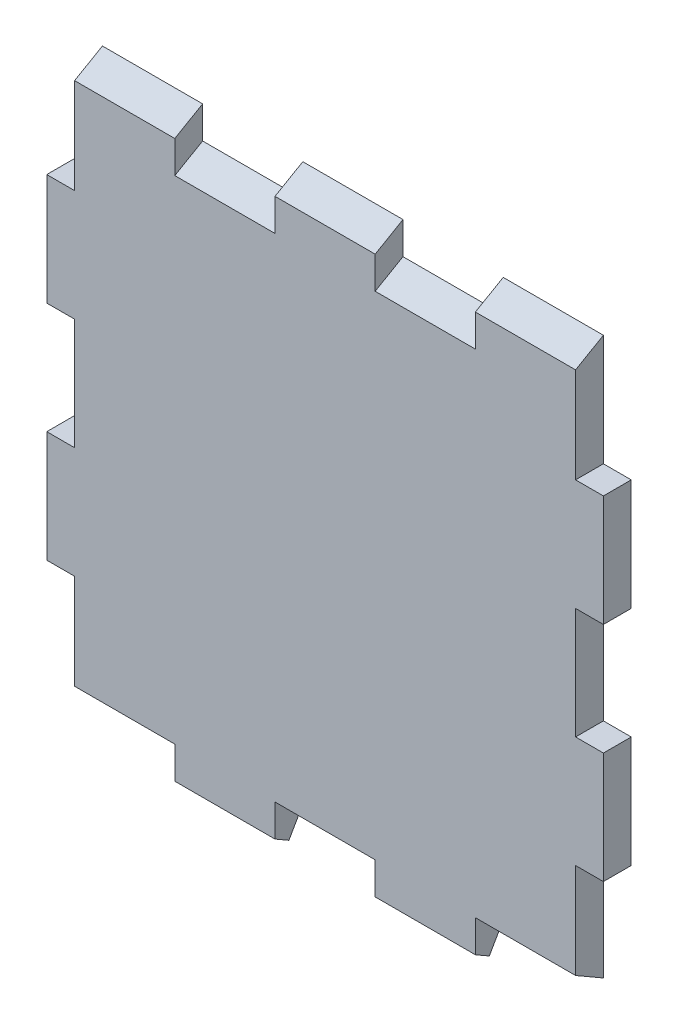
ISO-10303-21;
HEADER;
FILE_DESCRIPTION(('STEP AP214'),'2;1');
FILE_NAME('part.step','',(''),(''),'','','');
FILE_SCHEMA(('AUTOMOTIVE_DESIGN { 1 0 10303 214 1 1 1 1 }'));
ENDSEC;
DATA;
#1=APPLICATION_CONTEXT('core data for automotive mechanical design processes');
#2=APPLICATION_PROTOCOL_DEFINITION('international standard','automotive_design',2000,#1);
#3=PRODUCT_CONTEXT('',#1,'mechanical');
#4=PRODUCT('Part','Part','',(#3));
#5=PRODUCT_RELATED_PRODUCT_CATEGORY('part','',(#4));
#6=PRODUCT_DEFINITION_FORMATION('','',#4);
#7=PRODUCT_DEFINITION_CONTEXT('part definition',#1,'design');
#8=PRODUCT_DEFINITION('design','',#6,#7);
#9=PRODUCT_DEFINITION_SHAPE('','',#8);
#10=(LENGTH_UNIT() NAMED_UNIT(*) SI_UNIT(.MILLI.,.METRE.));
#11=(NAMED_UNIT(*) PLANE_ANGLE_UNIT() SI_UNIT($,.RADIAN.));
#12=(NAMED_UNIT(*) SI_UNIT($,.STERADIAN.) SOLID_ANGLE_UNIT());
#13=UNCERTAINTY_MEASURE_WITH_UNIT(LENGTH_MEASURE(1.E-05),#10,'distance_accuracy_value','');
#14=(GEOMETRIC_REPRESENTATION_CONTEXT(3) GLOBAL_UNCERTAINTY_ASSIGNED_CONTEXT((#13)) GLOBAL_UNIT_ASSIGNED_CONTEXT((#10,
#11,#12)) REPRESENTATION_CONTEXT('',''));
#15=CARTESIAN_POINT('',(0.,0.,0.));
#16=DIRECTION('',(0.,0.,1.));
#17=DIRECTION('',(1.,0.,0.));
#18=AXIS2_PLACEMENT_3D('',#15,#16,#17);
#19=CARTESIAN_POINT('',(0.,0.,5.));
#20=DIRECTION('',(-1.,0.,0.));
#21=DIRECTION('',(0.,0.,1.));
#22=AXIS2_PLACEMENT_3D('',#19,#20,#21);
#23=PLANE('',#22);
#24=DIRECTION('',(0.,1.,0.));
#25=VECTOR('',#24,1.);
#26=CARTESIAN_POINT('',(0.,0.,5.));
#27=LINE('',#26,#25);
#28=CARTESIAN_POINT('',(0.,-22.8867513459641,5.));
#29=VERTEX_POINT('',#28);
#30=CARTESIAN_POINT('',(0.,-5.77350269191229,5.));
#31=VERTEX_POINT('',#30);
#32=EDGE_CURVE('E48',#29,#31,#27,.T.);
#33=ORIENTED_EDGE('',*,*,#32,.F.);
#34=DIRECTION('',(0.,0.,-1.));
#35=VECTOR('',#34,1.);
#36=CARTESIAN_POINT('',(0.,-22.8867513459642,5.));
#37=LINE('',#36,#35);
#38=CARTESIAN_POINT('',(0.,-22.8867513459642,0.));
#39=VERTEX_POINT('',#38);
#40=EDGE_CURVE('E290',#29,#39,#37,.T.);
#41=ORIENTED_EDGE('',*,*,#40,.T.);
#42=DIRECTION('',(0.,1.,0.));
#43=VECTOR('',#42,1.);
#44=CARTESIAN_POINT('',(0.,0.,0.));
#45=LINE('',#44,#43);
#46=CARTESIAN_POINT('',(0.,-2.88675134596416,0.));
#47=VERTEX_POINT('',#46);
#48=EDGE_CURVE('E487',#39,#47,#45,.T.);
#49=ORIENTED_EDGE('',*,*,#48,.T.);
#50=DIRECTION('',(0.,0.5,-0.866025403784439));
#51=VECTOR('',#50,1.);
#52=CARTESIAN_POINT('',(0.,-5.77350269191229,5.));
#53=LINE('',#52,#51);
#54=EDGE_CURVE('E476',#31,#47,#53,.T.);
#55=ORIENTED_EDGE('',*,*,#54,.F.);
#56=EDGE_LOOP('',(#33,#41,#49,#55));
#57=FACE_BOUND('',#56,.T.);
#58=ADVANCED_FACE('F33',(#57),#23,.F.);
#59=DIRECTION('',(0.,0.,-1.));
#60=VECTOR('',#59,1.);
#61=CARTESIAN_POINT('',(0.,-82.8867513459642,5.));
#62=LINE('',#61,#60);
#63=CARTESIAN_POINT('',(0.,-82.8867513459642,5.));
#64=VERTEX_POINT('',#63);
#65=CARTESIAN_POINT('',(0.,-82.8867513459642,0.));
#66=VERTEX_POINT('',#65);
#67=EDGE_CURVE('E325',#64,#66,#62,.T.);
#68=ORIENTED_EDGE('',*,*,#67,.F.);
#69=CARTESIAN_POINT('',(0.,-100.,5.));
#70=VERTEX_POINT('',#69);
#71=EDGE_CURVE('E494',#70,#64,#27,.T.);
#72=ORIENTED_EDGE('',*,*,#71,.F.);
#73=DIRECTION('',(0.,-0.500000000002089,-0.866025403783233));
#74=VECTOR('',#73,1.);
#75=CARTESIAN_POINT('',(0.,-100.,5.));
#76=LINE('',#75,#74);
#77=CARTESIAN_POINT('',(0.,-102.886751345964,0.));
#78=VERTEX_POINT('',#77);
#79=EDGE_CURVE('E447',#70,#78,#76,.T.);
#80=ORIENTED_EDGE('',*,*,#79,.T.);
#81=EDGE_CURVE('E509',#78,#66,#45,.T.);
#82=ORIENTED_EDGE('',*,*,#81,.T.);
#83=EDGE_LOOP('',(#68,#72,#80,#82));
#84=FACE_BOUND('',#83,.T.);
#85=ADVANCED_FACE('F567',(#84),#23,.F.);
#86=CARTESIAN_POINT('',(-90.,0.,5.));
#87=DIRECTION('',(1.,0.,0.));
#88=DIRECTION('',(0.,0.,-1.));
#89=AXIS2_PLACEMENT_3D('',#86,#87,#88);
#90=PLANE('',#89);
#91=DIRECTION('',(0.,-1.,0.));
#92=VECTOR('',#91,1.);
#93=CARTESIAN_POINT('',(-90.,0.,0.));
#94=LINE('',#93,#92);
#95=CARTESIAN_POINT('',(-90.,-42.8867513459642,0.));
#96=VERTEX_POINT('',#95);
#97=CARTESIAN_POINT('',(-90.,-62.8867513459642,0.));
#98=VERTEX_POINT('',#97);
#99=EDGE_CURVE('E517',#96,#98,#94,.T.);
#100=ORIENTED_EDGE('',*,*,#99,.T.);
#101=DIRECTION('',(0.,0.,-1.));
#102=VECTOR('',#101,1.);
#103=CARTESIAN_POINT('',(-90.,-62.8867513459642,5.));
#104=LINE('',#103,#102);
#105=CARTESIAN_POINT('',(-90.,-62.8867513459642,5.));
#106=VERTEX_POINT('',#105);
#107=EDGE_CURVE('E348',#106,#98,#104,.T.);
#108=ORIENTED_EDGE('',*,*,#107,.F.);
#109=DIRECTION('',(0.,-1.,0.));
#110=VECTOR('',#109,1.);
#111=CARTESIAN_POINT('',(-90.,0.,5.));
#112=LINE('',#111,#110);
#113=CARTESIAN_POINT('',(-90.,-42.8867513459642,5.));
#114=VERTEX_POINT('',#113);
#115=EDGE_CURVE('E503',#114,#106,#112,.T.);
#116=ORIENTED_EDGE('',*,*,#115,.F.);
#117=DIRECTION('',(0.,0.,-1.));
#118=VECTOR('',#117,1.);
#119=CARTESIAN_POINT('',(-90.,-42.8867513459642,5.));
#120=LINE('',#119,#118);
#121=EDGE_CURVE('E367',#114,#96,#120,.T.);
#122=ORIENTED_EDGE('',*,*,#121,.T.);
#123=EDGE_LOOP('',(#100,#108,#116,#122));
#124=FACE_BOUND('',#123,.T.);
#125=ADVANCED_FACE('F619',(#124),#90,.F.);
#126=DIRECTION('',(0.,0.,-1.));
#127=VECTOR('',#126,1.);
#128=CARTESIAN_POINT('',(-90.,-22.8867513459642,5.));
#129=LINE('',#128,#127);
#130=CARTESIAN_POINT('',(-90.,-22.8867513459642,5.));
#131=VERTEX_POINT('',#130);
#132=CARTESIAN_POINT('',(-90.,-22.8867513459642,0.));
#133=VERTEX_POINT('',#132);
#134=EDGE_CURVE('E375',#131,#133,#129,.T.);
#135=ORIENTED_EDGE('',*,*,#134,.F.);
#136=CARTESIAN_POINT('',(-90.,-5.77350269191229,5.));
#137=VERTEX_POINT('',#136);
#138=EDGE_CURVE('E499',#137,#131,#112,.T.);
#139=ORIENTED_EDGE('',*,*,#138,.F.);
#140=DIRECTION('',(0.,0.5,-0.866025403784439));
#141=VECTOR('',#140,1.);
#142=CARTESIAN_POINT('',(-90.,-5.77350269191229,5.));
#143=LINE('',#142,#141);
#144=CARTESIAN_POINT('',(-90.,-2.88675134596416,0.));
#145=VERTEX_POINT('',#144);
#146=EDGE_CURVE('E478',#137,#145,#143,.T.);
#147=ORIENTED_EDGE('',*,*,#146,.T.);
#148=EDGE_CURVE('E514',#145,#133,#94,.T.);
#149=ORIENTED_EDGE('',*,*,#148,.T.);
#150=EDGE_LOOP('',(#135,#139,#147,#149));
#151=FACE_BOUND('',#150,.T.);
#152=ADVANCED_FACE('F627',(#151),#90,.F.);
#153=CARTESIAN_POINT('',(-90.,-100.,5.));
#154=DIRECTION('',(0.,-0.866025403783232,0.500000000002089));
#155=DIRECTION('',(0.,-0.500000000002089,-0.866025403783233));
#156=AXIS2_PLACEMENT_3D('',#153,#154,#155);
#157=PLANE('',#156);
#158=DIRECTION('',(0.,-0.500000000002089,-0.866025403783233));
#159=VECTOR('',#158,1.);
#160=CARTESIAN_POINT('',(-36.,-100.,5.));
#161=LINE('',#160,#159);
#162=CARTESIAN_POINT('',(-36.,-100.,5.));
#163=VERTEX_POINT('',#162);
#164=CARTESIAN_POINT('',(-36.,-102.886751345964,0.));
#165=VERTEX_POINT('',#164);
#166=EDGE_CURVE('E526',#163,#165,#161,.T.);
#167=ORIENTED_EDGE('',*,*,#166,.F.);
#168=DIRECTION('',(1.,0.,0.));
#169=VECTOR('',#168,1.);
#170=CARTESIAN_POINT('',(0.,-100.,5.));
#171=LINE('',#170,#169);
#172=CARTESIAN_POINT('',(-54.,-100.,5.));
#173=VERTEX_POINT('',#172);
#174=EDGE_CURVE('E508',#173,#163,#171,.T.);
#175=ORIENTED_EDGE('',*,*,#174,.F.);
#176=DIRECTION('',(0.,0.500000000002089,0.866025403783233));
#177=VECTOR('',#176,1.);
#178=CARTESIAN_POINT('',(-54.,-100.,5.));
#179=LINE('',#178,#177);
#180=CARTESIAN_POINT('',(-54.,-102.886751345964,0.));
#181=VERTEX_POINT('',#180);
#182=EDGE_CURVE('E507',#181,#173,#179,.T.);
#183=ORIENTED_EDGE('',*,*,#182,.F.);
#184=DIRECTION('',(1.,0.,0.));
#185=VECTOR('',#184,1.);
#186=CARTESIAN_POINT('',(-90.,-102.886751345964,0.));
#187=LINE('',#186,#185);
#188=EDGE_CURVE('E477',#181,#165,#187,.T.);
#189=ORIENTED_EDGE('',*,*,#188,.T.);
#190=EDGE_LOOP('',(#167,#175,#183,#189));
#191=FACE_BOUND('',#190,.T.);
#192=ADVANCED_FACE('F552',(#191),#157,.T.);
#193=DIRECTION('',(0.,-0.500000000002089,-0.866025403783233));
#194=VECTOR('',#193,1.);
#195=CARTESIAN_POINT('',(-72.,-100.,5.));
#196=LINE('',#195,#194);
#197=CARTESIAN_POINT('',(-72.,-100.,5.));
#198=VERTEX_POINT('',#197);
#199=CARTESIAN_POINT('',(-72.,-102.886751345964,0.));
#200=VERTEX_POINT('',#199);
#201=EDGE_CURVE('E520',#198,#200,#196,.T.);
#202=ORIENTED_EDGE('',*,*,#201,.F.);
#203=CARTESIAN_POINT('',(-90.,-100.,5.));
#204=VERTEX_POINT('',#203);
#205=EDGE_CURVE('E504',#204,#198,#171,.T.);
#206=ORIENTED_EDGE('',*,*,#205,.F.);
#207=DIRECTION('',(0.,-0.500000000002089,-0.866025403783233));
#208=VECTOR('',#207,1.);
#209=CARTESIAN_POINT('',(-90.,-100.,5.));
#210=LINE('',#209,#208);
#211=CARTESIAN_POINT('',(-90.,-102.886751345964,0.));
#212=VERTEX_POINT('',#211);
#213=EDGE_CURVE('E467',#204,#212,#210,.T.);
#214=ORIENTED_EDGE('',*,*,#213,.T.);
#215=EDGE_CURVE('E473',#212,#200,#187,.T.);
#216=ORIENTED_EDGE('',*,*,#215,.T.);
#217=EDGE_LOOP('',(#202,#206,#214,#216));
#218=FACE_BOUND('',#217,.T.);
#219=ADVANCED_FACE('F633',(#218),#157,.T.);
#220=CARTESIAN_POINT('',(-90.,-5.77350269191229,5.));
#221=DIRECTION('',(0.,-0.866025403784439,-0.5));
#222=DIRECTION('',(0.,0.5,-0.866025403784439));
#223=AXIS2_PLACEMENT_3D('',#220,#221,#222);
#224=PLANE('',#223);
#225=DIRECTION('',(1.,0.,0.));
#226=VECTOR('',#225,1.);
#227=CARTESIAN_POINT('',(-90.,-2.88675134596416,0.));
#228=LINE('',#227,#226);
#229=CARTESIAN_POINT('',(-18.,-2.88675134596416,0.));
#230=VERTEX_POINT('',#229);
#231=EDGE_CURVE('E489',#230,#47,#228,.T.);
#232=ORIENTED_EDGE('',*,*,#231,.F.);
#233=DIRECTION('',(0.,-0.5,0.866025403784439));
#234=VECTOR('',#233,1.);
#235=CARTESIAN_POINT('',(-18.,-5.77350269191249,5.00000000000034));
#236=LINE('',#235,#234);
#237=CARTESIAN_POINT('',(-18.,-5.77350269191229,5.));
#238=VERTEX_POINT('',#237);
#239=EDGE_CURVE('E433',#230,#238,#236,.T.);
#240=ORIENTED_EDGE('',*,*,#239,.T.);
#241=DIRECTION('',(1.,0.,0.));
#242=VECTOR('',#241,1.);
#243=CARTESIAN_POINT('',(-90.,-5.77350269191229,5.));
#244=LINE('',#243,#242);
#245=EDGE_CURVE('E481',#238,#31,#244,.T.);
#246=ORIENTED_EDGE('',*,*,#245,.T.);
#247=ORIENTED_EDGE('',*,*,#54,.T.);
#248=EDGE_LOOP('',(#232,#240,#246,#247));
#249=FACE_BOUND('',#248,.T.);
#250=ADVANCED_FACE('F582',(#249),#224,.F.);
#251=CARTESIAN_POINT('',(-54.,-5.77350269191229,5.));
#252=VERTEX_POINT('',#251);
#253=CARTESIAN_POINT('',(-36.,-5.77350269191229,5.));
#254=VERTEX_POINT('',#253);
#255=EDGE_CURVE('E493',#252,#254,#244,.T.);
#256=ORIENTED_EDGE('',*,*,#255,.T.);
#257=DIRECTION('',(0.,0.5,-0.866025403784439));
#258=VECTOR('',#257,1.);
#259=CARTESIAN_POINT('',(-36.,-5.77350269191229,5.));
#260=LINE('',#259,#258);
#261=CARTESIAN_POINT('',(-36.,-2.88675134596416,0.));
#262=VERTEX_POINT('',#261);
#263=EDGE_CURVE('E430',#254,#262,#260,.T.);
#264=ORIENTED_EDGE('',*,*,#263,.T.);
#265=CARTESIAN_POINT('',(-54.,-2.88675134596416,0.));
#266=VERTEX_POINT('',#265);
#267=EDGE_CURVE('E488',#266,#262,#228,.T.);
#268=ORIENTED_EDGE('',*,*,#267,.F.);
#269=DIRECTION('',(0.,-0.5,0.866025403784439));
#270=VECTOR('',#269,1.);
#271=CARTESIAN_POINT('',(-54.,-5.77350269191233,5.00000000000008));
#272=LINE('',#271,#270);
#273=EDGE_CURVE('E438',#266,#252,#272,.T.);
#274=ORIENTED_EDGE('',*,*,#273,.T.);
#275=EDGE_LOOP('',(#256,#264,#268,#274));
#276=FACE_BOUND('',#275,.T.);
#277=ADVANCED_FACE('F592',(#276),#224,.F.);
#278=CARTESIAN_POINT('',(0.,-62.8867513459641,0.));
#279=VERTEX_POINT('',#278);
#280=CARTESIAN_POINT('',(0.,-42.8867513459641,0.));
#281=VERTEX_POINT('',#280);
#282=EDGE_CURVE('E513',#279,#281,#45,.T.);
#283=ORIENTED_EDGE('',*,*,#282,.T.);
#284=DIRECTION('',(0.,0.,-1.));
#285=VECTOR('',#284,1.);
#286=CARTESIAN_POINT('',(0.,-42.8867513459642,5.));
#287=LINE('',#286,#285);
#288=CARTESIAN_POINT('',(0.,-42.8867513459641,5.));
#289=VERTEX_POINT('',#288);
#290=EDGE_CURVE('E56',#289,#281,#287,.T.);
#291=ORIENTED_EDGE('',*,*,#290,.F.);
#292=CARTESIAN_POINT('',(0.,-62.8867513459642,5.));
#293=VERTEX_POINT('',#292);
#294=EDGE_CURVE('E498',#293,#289,#27,.T.);
#295=ORIENTED_EDGE('',*,*,#294,.F.);
#296=DIRECTION('',(0.,0.,-1.));
#297=VECTOR('',#296,1.);
#298=CARTESIAN_POINT('',(0.,-62.8867513459642,5.));
#299=LINE('',#298,#297);
#300=EDGE_CURVE('E321',#293,#279,#299,.T.);
#301=ORIENTED_EDGE('',*,*,#300,.T.);
#302=EDGE_LOOP('',(#283,#291,#295,#301));
#303=FACE_BOUND('',#302,.T.);
#304=ADVANCED_FACE('F35',(#303),#23,.F.);
#305=CARTESIAN_POINT('',(-90.,-82.8867513459642,5.));
#306=VERTEX_POINT('',#305);
#307=EDGE_CURVE('E497',#306,#204,#112,.T.);
#308=ORIENTED_EDGE('',*,*,#307,.F.);
#309=DIRECTION('',(0.,0.,-1.));
#310=VECTOR('',#309,1.);
#311=CARTESIAN_POINT('',(-90.,-82.8867513459642,5.));
#312=LINE('',#311,#310);
#313=CARTESIAN_POINT('',(-90.,-82.8867513459642,0.));
#314=VERTEX_POINT('',#313);
#315=EDGE_CURVE('E340',#306,#314,#312,.T.);
#316=ORIENTED_EDGE('',*,*,#315,.T.);
#317=EDGE_CURVE('E512',#314,#212,#94,.T.);
#318=ORIENTED_EDGE('',*,*,#317,.T.);
#319=ORIENTED_EDGE('',*,*,#213,.F.);
#320=EDGE_LOOP('',(#308,#316,#318,#319));
#321=FACE_BOUND('',#320,.T.);
#322=ADVANCED_FACE('F621',(#321),#90,.F.);
#323=CARTESIAN_POINT('',(0.,0.,5.));
#324=DIRECTION('',(0.,0.,-1.));
#325=DIRECTION('',(-1.,0.,0.));
#326=AXIS2_PLACEMENT_3D('',#323,#324,#325);
#327=PLANE('',#326);
#328=DIRECTION('',(0.,-1.,0.));
#329=VECTOR('',#328,1.);
#330=CARTESIAN_POINT('',(-72.,-100.,5.));
#331=LINE('',#330,#329);
#332=CARTESIAN_POINT('',(-72.,-105.773502691912,4.99999999999999));
#333=VERTEX_POINT('',#332);
#334=EDGE_CURVE('E412',#198,#333,#331,.T.);
#335=ORIENTED_EDGE('',*,*,#334,.T.);
#336=DIRECTION('',(-1.,0.,0.));
#337=VECTOR('',#336,1.);
#338=CARTESIAN_POINT('',(0.,-105.773502691912,4.99999999999999));
#339=LINE('',#338,#337);
#340=CARTESIAN_POINT('',(-54.,-105.773502691912,4.99999999999999));
#341=VERTEX_POINT('',#340);
#342=EDGE_CURVE('E388',#341,#333,#339,.T.);
#343=ORIENTED_EDGE('',*,*,#342,.F.);
#344=DIRECTION('',(0.,1.,0.));
#345=VECTOR('',#344,1.);
#346=CARTESIAN_POINT('',(-54.,-100.,5.));
#347=LINE('',#346,#345);
#348=EDGE_CURVE('E414',#341,#173,#347,.T.);
#349=ORIENTED_EDGE('',*,*,#348,.T.);
#350=ORIENTED_EDGE('',*,*,#174,.T.);
#351=DIRECTION('',(0.,-1.,0.));
#352=VECTOR('',#351,1.);
#353=CARTESIAN_POINT('',(-36.,-100.,5.));
#354=LINE('',#353,#352);
#355=CARTESIAN_POINT('',(-36.,-105.773502691912,4.99999999999999));
#356=VERTEX_POINT('',#355);
#357=EDGE_CURVE('E407',#163,#356,#354,.T.);
#358=ORIENTED_EDGE('',*,*,#357,.T.);
#359=CARTESIAN_POINT('',(-18.,-105.773502691912,4.99999999999999));
#360=VERTEX_POINT('',#359);
#361=EDGE_CURVE('E396',#360,#356,#339,.T.);
#362=ORIENTED_EDGE('',*,*,#361,.F.);
#363=DIRECTION('',(0.,1.,0.));
#364=VECTOR('',#363,1.);
#365=CARTESIAN_POINT('',(-18.,-100.,5.));
#366=LINE('',#365,#364);
#367=CARTESIAN_POINT('',(-18.,-100.,5.));
#368=VERTEX_POINT('',#367);
#369=EDGE_CURVE('E410',#360,#368,#366,.T.);
#370=ORIENTED_EDGE('',*,*,#369,.T.);
#371=EDGE_CURVE('E502',#368,#70,#171,.T.);
#372=ORIENTED_EDGE('',*,*,#371,.T.);
#373=ORIENTED_EDGE('',*,*,#71,.T.);
#374=DIRECTION('',(-1.,0.,0.));
#375=VECTOR('',#374,1.);
#376=CARTESIAN_POINT('',(0.,-82.8867513459642,5.));
#377=LINE('',#376,#375);
#378=CARTESIAN_POINT('',(5.00000000000002,-82.8867513459642,5.));
#379=VERTEX_POINT('',#378);
#380=EDGE_CURVE('E311',#379,#64,#377,.T.);
#381=ORIENTED_EDGE('',*,*,#380,.F.);
#382=DIRECTION('',(0.,-1.,0.));
#383=VECTOR('',#382,1.);
#384=CARTESIAN_POINT('',(5.,-62.8867513459641,5.));
#385=LINE('',#384,#383);
#386=CARTESIAN_POINT('',(5.,-62.8867513459641,5.));
#387=VERTEX_POINT('',#386);
#388=EDGE_CURVE('E307',#387,#379,#385,.T.);
#389=ORIENTED_EDGE('',*,*,#388,.F.);
#390=DIRECTION('',(1.,0.,0.));
#391=VECTOR('',#390,1.);
#392=CARTESIAN_POINT('',(0.,-62.8867513459642,5.));
#393=LINE('',#392,#391);
#394=EDGE_CURVE('E304',#293,#387,#393,.T.);
#395=ORIENTED_EDGE('',*,*,#394,.F.);
#396=ORIENTED_EDGE('',*,*,#294,.T.);
#397=DIRECTION('',(-1.,0.,0.));
#398=VECTOR('',#397,1.);
#399=CARTESIAN_POINT('',(0.,-42.8867513459642,5.));
#400=LINE('',#399,#398);
#401=CARTESIAN_POINT('',(5.,-42.8867513459642,5.));
#402=VERTEX_POINT('',#401);
#403=EDGE_CURVE('E279',#402,#289,#400,.T.);
#404=ORIENTED_EDGE('',*,*,#403,.F.);
#405=DIRECTION('',(0.,-1.,0.));
#406=VECTOR('',#405,1.);
#407=CARTESIAN_POINT('',(4.99999999999999,-22.8867513459642,5.));
#408=LINE('',#407,#406);
#409=CARTESIAN_POINT('',(4.99999999999999,-22.8867513459642,5.));
#410=VERTEX_POINT('',#409);
#411=EDGE_CURVE('E271',#410,#402,#408,.T.);
#412=ORIENTED_EDGE('',*,*,#411,.F.);
#413=DIRECTION('',(1.,0.,0.));
#414=VECTOR('',#413,1.);
#415=CARTESIAN_POINT('',(0.,-22.8867513459642,5.));
#416=LINE('',#415,#414);
#417=EDGE_CURVE('E286',#29,#410,#416,.T.);
#418=ORIENTED_EDGE('',*,*,#417,.F.);
#419=ORIENTED_EDGE('',*,*,#32,.T.);
#420=ORIENTED_EDGE('',*,*,#245,.F.);
#421=DIRECTION('',(0.,1.,0.));
#422=VECTOR('',#421,1.);
#423=CARTESIAN_POINT('',(-18.,-11.5470053838204,5.));
#424=LINE('',#423,#422);
#425=CARTESIAN_POINT('',(-18.,-11.5470053838204,5.));
#426=VERTEX_POINT('',#425);
#427=EDGE_CURVE('E459',#426,#238,#424,.T.);
#428=ORIENTED_EDGE('',*,*,#427,.F.);
#429=DIRECTION('',(1.,0.,0.));
#430=VECTOR('',#429,1.);
#431=CARTESIAN_POINT('',(-36.,-11.5470053838204,5.));
#432=LINE('',#431,#430);
#433=CARTESIAN_POINT('',(-36.,-11.5470053838204,5.));
#434=VERTEX_POINT('',#433);
#435=EDGE_CURVE('E462',#434,#426,#432,.T.);
#436=ORIENTED_EDGE('',*,*,#435,.F.);
#437=DIRECTION('',(0.,-1.,0.));
#438=VECTOR('',#437,1.);
#439=CARTESIAN_POINT('',(-36.,-11.5470053838204,5.));
#440=LINE('',#439,#438);
#441=EDGE_CURVE('E440',#254,#434,#440,.T.);
#442=ORIENTED_EDGE('',*,*,#441,.F.);
#443=ORIENTED_EDGE('',*,*,#255,.F.);
#444=DIRECTION('',(0.,1.,0.));
#445=VECTOR('',#444,1.);
#446=CARTESIAN_POINT('',(-54.,-11.5470053838204,5.));
#447=LINE('',#446,#445);
#448=CARTESIAN_POINT('',(-54.,-11.5470053838204,5.));
#449=VERTEX_POINT('',#448);
#450=EDGE_CURVE('E445',#449,#252,#447,.T.);
#451=ORIENTED_EDGE('',*,*,#450,.F.);
#452=DIRECTION('',(1.,0.,0.));
#453=VECTOR('',#452,1.);
#454=CARTESIAN_POINT('',(-72.,-11.5470053838204,5.));
#455=LINE('',#454,#453);
#456=CARTESIAN_POINT('',(-72.,-11.5470053838204,5.));
#457=VERTEX_POINT('',#456);
#458=EDGE_CURVE('E450',#457,#449,#455,.T.);
#459=ORIENTED_EDGE('',*,*,#458,.F.);
#460=DIRECTION('',(0.,-1.,0.));
#461=VECTOR('',#460,1.);
#462=CARTESIAN_POINT('',(-72.,-11.5470053838204,5.));
#463=LINE('',#462,#461);
#464=CARTESIAN_POINT('',(-72.,-5.77350269191229,5.));
#465=VERTEX_POINT('',#464);
#466=EDGE_CURVE('E448',#465,#457,#463,.T.);
#467=ORIENTED_EDGE('',*,*,#466,.F.);
#468=EDGE_CURVE('E490',#137,#465,#244,.T.);
#469=ORIENTED_EDGE('',*,*,#468,.F.);
#470=ORIENTED_EDGE('',*,*,#138,.T.);
#471=DIRECTION('',(1.,0.,0.));
#472=VECTOR('',#471,1.);
#473=CARTESIAN_POINT('',(-90.,-22.8867513459642,5.));
#474=LINE('',#473,#472);
#475=CARTESIAN_POINT('',(-95.,-22.8867513459642,5.));
#476=VERTEX_POINT('',#475);
#477=EDGE_CURVE('E365',#476,#131,#474,.T.);
#478=ORIENTED_EDGE('',*,*,#477,.F.);
#479=DIRECTION('',(0.,1.,0.));
#480=VECTOR('',#479,1.);
#481=CARTESIAN_POINT('',(-95.,-22.8867513459642,5.));
#482=LINE('',#481,#480);
#483=CARTESIAN_POINT('',(-95.,-42.8867513459642,5.));
#484=VERTEX_POINT('',#483);
#485=EDGE_CURVE('E361',#484,#476,#482,.T.);
#486=ORIENTED_EDGE('',*,*,#485,.F.);
#487=DIRECTION('',(-1.,0.,0.));
#488=VECTOR('',#487,1.);
#489=CARTESIAN_POINT('',(-90.,-42.8867513459642,5.));
#490=LINE('',#489,#488);
#491=EDGE_CURVE('E358',#114,#484,#490,.T.);
#492=ORIENTED_EDGE('',*,*,#491,.F.);
#493=ORIENTED_EDGE('',*,*,#115,.T.);
#494=DIRECTION('',(1.,0.,0.));
#495=VECTOR('',#494,1.);
#496=CARTESIAN_POINT('',(-90.,-62.8867513459642,5.));
#497=LINE('',#496,#495);
#498=CARTESIAN_POINT('',(-95.,-62.8867513459642,5.));
#499=VERTEX_POINT('',#498);
#500=EDGE_CURVE('E337',#499,#106,#497,.T.);
#501=ORIENTED_EDGE('',*,*,#500,.F.);
#502=DIRECTION('',(0.,1.,0.));
#503=VECTOR('',#502,1.);
#504=CARTESIAN_POINT('',(-95.,-62.8867513459642,5.));
#505=LINE('',#504,#503);
#506=CARTESIAN_POINT('',(-95.,-82.8867513459642,5.));
#507=VERTEX_POINT('',#506);
#508=EDGE_CURVE('E333',#507,#499,#505,.T.);
#509=ORIENTED_EDGE('',*,*,#508,.F.);
#510=DIRECTION('',(-1.,0.,0.));
#511=VECTOR('',#510,1.);
#512=CARTESIAN_POINT('',(-90.,-82.8867513459642,5.));
#513=LINE('',#512,#511);
#514=EDGE_CURVE('E330',#306,#507,#513,.T.);
#515=ORIENTED_EDGE('',*,*,#514,.F.);
#516=ORIENTED_EDGE('',*,*,#307,.T.);
#517=ORIENTED_EDGE('',*,*,#205,.T.);
#518=EDGE_LOOP('',(#335,#343,#349,#350,#358,#362,#370,#372,#373,#381,#389,#395,#396,#404,#412,
#418,#419,#420,#428,#436,#442,#443,#451,#459,#467,#469,#470,#478,#486,#492,#493,#501,#509,#515,
#516,#517));
#519=FACE_BOUND('',#518,.T.);
#520=ADVANCED_FACE('F285',(#519),#327,.F.);
#521=CARTESIAN_POINT('',(0.,0.,0.));
#522=DIRECTION('',(0.,0.,-1.));
#523=DIRECTION('',(-1.,0.,0.));
#524=AXIS2_PLACEMENT_3D('',#521,#522,#523);
#525=PLANE('',#524);
#526=DIRECTION('',(-1.,0.,0.));
#527=VECTOR('',#526,1.);
#528=CARTESIAN_POINT('',(0.,-102.886751345964,0.));
#529=LINE('',#528,#527);
#530=EDGE_CURVE('E389',#181,#200,#529,.T.);
#531=ORIENTED_EDGE('',*,*,#530,.T.);
#532=ORIENTED_EDGE('',*,*,#215,.F.);
#533=ORIENTED_EDGE('',*,*,#317,.F.);
#534=DIRECTION('',(-1.,0.,0.));
#535=VECTOR('',#534,1.);
#536=CARTESIAN_POINT('',(-90.,-82.8867513459642,0.));
#537=LINE('',#536,#535);
#538=CARTESIAN_POINT('',(-95.,-82.8867513459642,0.));
#539=VERTEX_POINT('',#538);
#540=EDGE_CURVE('E324',#314,#539,#537,.T.);
#541=ORIENTED_EDGE('',*,*,#540,.T.);
#542=DIRECTION('',(0.,1.,0.));
#543=VECTOR('',#542,1.);
#544=CARTESIAN_POINT('',(-95.,-62.8867513459642,0.));
#545=LINE('',#544,#543);
#546=CARTESIAN_POINT('',(-95.,-62.8867513459642,0.));
#547=VERTEX_POINT('',#546);
#548=EDGE_CURVE('E343',#539,#547,#545,.T.);
#549=ORIENTED_EDGE('',*,*,#548,.T.);
#550=DIRECTION('',(1.,0.,0.));
#551=VECTOR('',#550,1.);
#552=CARTESIAN_POINT('',(-90.,-62.8867513459642,0.));
#553=LINE('',#552,#551);
#554=EDGE_CURVE('E334',#547,#98,#553,.T.);
#555=ORIENTED_EDGE('',*,*,#554,.T.);
#556=ORIENTED_EDGE('',*,*,#99,.F.);
#557=DIRECTION('',(-1.,0.,0.));
#558=VECTOR('',#557,1.);
#559=CARTESIAN_POINT('',(-90.,-42.8867513459642,0.));
#560=LINE('',#559,#558);
#561=CARTESIAN_POINT('',(-95.,-42.8867513459642,0.));
#562=VERTEX_POINT('',#561);
#563=EDGE_CURVE('E351',#96,#562,#560,.T.);
#564=ORIENTED_EDGE('',*,*,#563,.T.);
#565=DIRECTION('',(0.,1.,0.));
#566=VECTOR('',#565,1.);
#567=CARTESIAN_POINT('',(-95.,-22.8867513459642,0.));
#568=LINE('',#567,#566);
#569=CARTESIAN_POINT('',(-95.,-22.8867513459642,0.));
#570=VERTEX_POINT('',#569);
#571=EDGE_CURVE('E370',#562,#570,#568,.T.);
#572=ORIENTED_EDGE('',*,*,#571,.T.);
#573=DIRECTION('',(1.,0.,0.));
#574=VECTOR('',#573,1.);
#575=CARTESIAN_POINT('',(-90.,-22.8867513459642,0.));
#576=LINE('',#575,#574);
#577=EDGE_CURVE('E362',#570,#133,#576,.T.);
#578=ORIENTED_EDGE('',*,*,#577,.T.);
#579=ORIENTED_EDGE('',*,*,#148,.F.);
#580=CARTESIAN_POINT('',(-72.,-2.88675134596416,0.));
#581=VERTEX_POINT('',#580);
#582=EDGE_CURVE('E484',#145,#581,#228,.T.);
#583=ORIENTED_EDGE('',*,*,#582,.T.);
#584=DIRECTION('',(0.,-1.,0.));
#585=VECTOR('',#584,1.);
#586=CARTESIAN_POINT('',(-72.,-11.5470053838204,0.));
#587=LINE('',#586,#585);
#588=CARTESIAN_POINT('',(-72.,-8.6638015099347,0.));
#589=VERTEX_POINT('',#588);
#590=EDGE_CURVE('E441',#581,#589,#587,.T.);
#591=ORIENTED_EDGE('',*,*,#590,.T.);
#592=DIRECTION('',(1.,0.,0.));
#593=VECTOR('',#592,1.);
#594=CARTESIAN_POINT('',(-90.,-8.6638015099347,0.));
#595=LINE('',#594,#593);
#596=CARTESIAN_POINT('',(-54.,-8.6638015099347,0.));
#597=VERTEX_POINT('',#596);
#598=EDGE_CURVE('E419',#589,#597,#595,.T.);
#599=ORIENTED_EDGE('',*,*,#598,.T.);
#600=DIRECTION('',(0.,1.,0.));
#601=VECTOR('',#600,1.);
#602=CARTESIAN_POINT('',(-54.,-11.5470053838204,0.));
#603=LINE('',#602,#601);
#604=EDGE_CURVE('E444',#597,#266,#603,.T.);
#605=ORIENTED_EDGE('',*,*,#604,.T.);
#606=ORIENTED_EDGE('',*,*,#267,.T.);
#607=DIRECTION('',(0.,-1.,0.));
#608=VECTOR('',#607,1.);
#609=CARTESIAN_POINT('',(-36.,-11.5470053838204,0.));
#610=LINE('',#609,#608);
#611=CARTESIAN_POINT('',(-36.,-8.6638015099347,0.));
#612=VERTEX_POINT('',#611);
#613=EDGE_CURVE('E456',#262,#612,#610,.T.);
#614=ORIENTED_EDGE('',*,*,#613,.T.);
#615=CARTESIAN_POINT('',(-18.,-8.6638015099347,0.));
#616=VERTEX_POINT('',#615);
#617=EDGE_CURVE('E416',#612,#616,#595,.T.);
#618=ORIENTED_EDGE('',*,*,#617,.T.);
#619=DIRECTION('',(0.,1.,0.));
#620=VECTOR('',#619,1.);
#621=CARTESIAN_POINT('',(-18.,-11.5470053838204,0.));
#622=LINE('',#621,#620);
#623=EDGE_CURVE('E451',#616,#230,#622,.T.);
#624=ORIENTED_EDGE('',*,*,#623,.T.);
#625=ORIENTED_EDGE('',*,*,#231,.T.);
#626=ORIENTED_EDGE('',*,*,#48,.F.);
#627=DIRECTION('',(1.,0.,0.));
#628=VECTOR('',#627,1.);
#629=CARTESIAN_POINT('',(0.,-22.8867513459642,0.));
#630=LINE('',#629,#628);
#631=CARTESIAN_POINT('',(4.99999999999999,-22.8867513459642,0.));
#632=VERTEX_POINT('',#631);
#633=EDGE_CURVE('E297',#39,#632,#630,.T.);
#634=ORIENTED_EDGE('',*,*,#633,.T.);
#635=DIRECTION('',(0.,-1.,0.));
#636=VECTOR('',#635,1.);
#637=CARTESIAN_POINT('',(4.99999999999999,-22.8867513459642,0.));
#638=LINE('',#637,#636);
#639=CARTESIAN_POINT('',(5.,-42.8867513459642,0.));
#640=VERTEX_POINT('',#639);
#641=EDGE_CURVE('E273',#632,#640,#638,.T.);
#642=ORIENTED_EDGE('',*,*,#641,.T.);
#643=DIRECTION('',(-1.,0.,0.));
#644=VECTOR('',#643,1.);
#645=CARTESIAN_POINT('',(0.,-42.8867513459642,0.));
#646=LINE('',#645,#644);
#647=EDGE_CURVE('E291',#640,#281,#646,.T.);
#648=ORIENTED_EDGE('',*,*,#647,.T.);
#649=ORIENTED_EDGE('',*,*,#282,.F.);
#650=DIRECTION('',(1.,0.,0.));
#651=VECTOR('',#650,1.);
#652=CARTESIAN_POINT('',(0.,-62.8867513459642,0.));
#653=LINE('',#652,#651);
#654=CARTESIAN_POINT('',(5.,-62.8867513459641,0.));
#655=VERTEX_POINT('',#654);
#656=EDGE_CURVE('E301',#279,#655,#653,.T.);
#657=ORIENTED_EDGE('',*,*,#656,.T.);
#658=DIRECTION('',(0.,-1.,0.));
#659=VECTOR('',#658,1.);
#660=CARTESIAN_POINT('',(5.,-62.8867513459641,0.));
#661=LINE('',#660,#659);
#662=CARTESIAN_POINT('',(5.00000000000002,-82.8867513459642,0.));
#663=VERTEX_POINT('',#662);
#664=EDGE_CURVE('E316',#655,#663,#661,.T.);
#665=ORIENTED_EDGE('',*,*,#664,.T.);
#666=DIRECTION('',(-1.,0.,0.));
#667=VECTOR('',#666,1.);
#668=CARTESIAN_POINT('',(0.,-82.8867513459642,0.));
#669=LINE('',#668,#667);
#670=EDGE_CURVE('E308',#663,#66,#669,.T.);
#671=ORIENTED_EDGE('',*,*,#670,.T.);
#672=ORIENTED_EDGE('',*,*,#81,.F.);
#673=CARTESIAN_POINT('',(-18.,-102.886751345964,0.));
#674=VERTEX_POINT('',#673);
#675=EDGE_CURVE('E470',#674,#78,#187,.T.);
#676=ORIENTED_EDGE('',*,*,#675,.F.);
#677=EDGE_CURVE('E392',#674,#165,#529,.T.);
#678=ORIENTED_EDGE('',*,*,#677,.T.);
#679=ORIENTED_EDGE('',*,*,#188,.F.);
#680=EDGE_LOOP('',(#531,#532,#533,#541,#549,#555,#556,#564,#572,#578,#579,#583,#591,#599,#605,
#606,#614,#618,#624,#625,#626,#634,#642,#648,#649,#657,#665,#671,#672,#676,#678,#679));
#681=FACE_BOUND('',#680,.T.);
#682=ADVANCED_FACE('F562',(#681),#525,.T.);
#683=ORIENTED_EDGE('',*,*,#468,.T.);
#684=DIRECTION('',(0.,0.5,-0.866025403784439));
#685=VECTOR('',#684,1.);
#686=CARTESIAN_POINT('',(-72.,-5.77350269191229,5.));
#687=LINE('',#686,#685);
#688=EDGE_CURVE('E435',#465,#581,#687,.T.);
#689=ORIENTED_EDGE('',*,*,#688,.T.);
#690=ORIENTED_EDGE('',*,*,#582,.F.);
#691=ORIENTED_EDGE('',*,*,#146,.F.);
#692=EDGE_LOOP('',(#683,#689,#690,#691));
#693=FACE_BOUND('',#692,.T.);
#694=ADVANCED_FACE('F629',(#693),#224,.F.);
#695=DIRECTION('',(0.,0.500000000002089,0.866025403783233));
#696=VECTOR('',#695,1.);
#697=CARTESIAN_POINT('',(-18.,-100.,4.99999999999999));
#698=LINE('',#697,#696);
#699=EDGE_CURVE('E523',#674,#368,#698,.T.);
#700=ORIENTED_EDGE('',*,*,#699,.F.);
#701=ORIENTED_EDGE('',*,*,#675,.T.);
#702=ORIENTED_EDGE('',*,*,#79,.F.);
#703=ORIENTED_EDGE('',*,*,#371,.F.);
#704=EDGE_LOOP('',(#700,#701,#702,#703));
#705=FACE_BOUND('',#704,.T.);
#706=ADVANCED_FACE('F544',(#705),#157,.T.);
#707=CARTESIAN_POINT('',(-36.,-11.5470053838204,0.));
#708=DIRECTION('',(-1.,0.,0.));
#709=DIRECTION('',(0.,0.,1.));
#710=AXIS2_PLACEMENT_3D('',#707,#708,#709);
#711=PLANE('',#710);
#712=ORIENTED_EDGE('',*,*,#441,.T.);
#713=DIRECTION('',(0.,0.499538957475091,-0.86629142323164));
#714=VECTOR('',#713,1.);
#715=CARTESIAN_POINT('',(-36.,-9.38327381166671,1.2476958501765));
#716=LINE('',#715,#714);
#717=EDGE_CURVE('E428',#434,#612,#716,.T.);
#718=ORIENTED_EDGE('',*,*,#717,.T.);
#719=ORIENTED_EDGE('',*,*,#613,.F.);
#720=ORIENTED_EDGE('',*,*,#263,.F.);
#721=EDGE_LOOP('',(#712,#718,#719,#720));
#722=FACE_BOUND('',#721,.T.);
#723=ADVANCED_FACE('F596',(#722),#711,.F.);
#724=CARTESIAN_POINT('',(-18.,-11.5470053838204,0.));
#725=DIRECTION('',(1.,0.,0.));
#726=DIRECTION('',(0.,0.,-1.));
#727=AXIS2_PLACEMENT_3D('',#724,#725,#726);
#728=PLANE('',#727);
#729=ORIENTED_EDGE('',*,*,#623,.F.);
#730=DIRECTION('',(0.,-0.499538957475091,0.86629142323164));
#731=VECTOR('',#730,1.);
#732=CARTESIAN_POINT('',(-18.,-9.38327381166671,1.2476958501765));
#733=LINE('',#732,#731);
#734=EDGE_CURVE('E425',#616,#426,#733,.T.);
#735=ORIENTED_EDGE('',*,*,#734,.T.);
#736=ORIENTED_EDGE('',*,*,#427,.T.);
#737=ORIENTED_EDGE('',*,*,#239,.F.);
#738=EDGE_LOOP('',(#729,#735,#736,#737));
#739=FACE_BOUND('',#738,.T.);
#740=ADVANCED_FACE('F603',(#739),#728,.F.);
#741=CARTESIAN_POINT('',(-72.,-11.5470053838204,0.));
#742=DIRECTION('',(-1.,0.,0.));
#743=DIRECTION('',(0.,0.,1.));
#744=AXIS2_PLACEMENT_3D('',#741,#742,#743);
#745=PLANE('',#744);
#746=ORIENTED_EDGE('',*,*,#466,.T.);
#747=DIRECTION('',(0.,0.499538957475091,-0.86629142323164));
#748=VECTOR('',#747,1.);
#749=CARTESIAN_POINT('',(-72.,-9.38327381166671,1.2476958501765));
#750=LINE('',#749,#748);
#751=EDGE_CURVE('E423',#457,#589,#750,.T.);
#752=ORIENTED_EDGE('',*,*,#751,.T.);
#753=ORIENTED_EDGE('',*,*,#590,.F.);
#754=ORIENTED_EDGE('',*,*,#688,.F.);
#755=EDGE_LOOP('',(#746,#752,#753,#754));
#756=FACE_BOUND('',#755,.T.);
#757=ADVANCED_FACE('F605',(#756),#745,.F.);
#758=CARTESIAN_POINT('',(-54.,-11.5470053838204,0.));
#759=DIRECTION('',(1.,0.,0.));
#760=DIRECTION('',(0.,0.,-1.));
#761=AXIS2_PLACEMENT_3D('',#758,#759,#760);
#762=PLANE('',#761);
#763=ORIENTED_EDGE('',*,*,#604,.F.);
#764=DIRECTION('',(0.,-0.499538957475091,0.86629142323164));
#765=VECTOR('',#764,1.);
#766=CARTESIAN_POINT('',(-54.,-9.38327381166671,1.2476958501765));
#767=LINE('',#766,#765);
#768=EDGE_CURVE('E420',#597,#449,#767,.T.);
#769=ORIENTED_EDGE('',*,*,#768,.T.);
#770=ORIENTED_EDGE('',*,*,#450,.T.);
#771=ORIENTED_EDGE('',*,*,#273,.F.);
#772=EDGE_LOOP('',(#763,#769,#770,#771));
#773=FACE_BOUND('',#772,.T.);
#774=ADVANCED_FACE('F611',(#773),#762,.F.);
#775=CARTESIAN_POINT('',(-90.,-11.5470053838204,5.));
#776=DIRECTION('',(0.,0.86629142323164,0.499538957475091));
#777=DIRECTION('',(0.,-0.499538957475091,0.86629142323164));
#778=AXIS2_PLACEMENT_3D('',#775,#776,#777);
#779=PLANE('',#778);
#780=ORIENTED_EDGE('',*,*,#751,.F.);
#781=ORIENTED_EDGE('',*,*,#458,.T.);
#782=ORIENTED_EDGE('',*,*,#768,.F.);
#783=ORIENTED_EDGE('',*,*,#598,.F.);
#784=EDGE_LOOP('',(#780,#781,#782,#783));
#785=FACE_BOUND('',#784,.T.);
#786=ADVANCED_FACE('F720',(#785),#779,.T.);
#787=ORIENTED_EDGE('',*,*,#717,.F.);
#788=ORIENTED_EDGE('',*,*,#435,.T.);
#789=ORIENTED_EDGE('',*,*,#734,.F.);
#790=ORIENTED_EDGE('',*,*,#617,.F.);
#791=EDGE_LOOP('',(#787,#788,#789,#790));
#792=FACE_BOUND('',#791,.T.);
#793=ADVANCED_FACE('F601',(#792),#779,.T.);
#794=CARTESIAN_POINT('',(-72.,-100.,0.));
#795=DIRECTION('',(-1.,0.,0.));
#796=DIRECTION('',(0.,0.,1.));
#797=AXIS2_PLACEMENT_3D('',#794,#795,#796);
#798=PLANE('',#797);
#799=DIRECTION('',(0.,0.86602540378445,-0.499999999999981));
#800=VECTOR('',#799,1.);
#801=CARTESIAN_POINT('',(-72.,-102.886751345964,0.));
#802=LINE('',#801,#800);
#803=CARTESIAN_POINT('',(-72.,-107.216878364886,2.49999999999993));
#804=VERTEX_POINT('',#803);
#805=EDGE_CURVE('E386',#804,#200,#802,.T.);
#806=ORIENTED_EDGE('',*,*,#805,.F.);
#807=DIRECTION('',(0.,-0.499999999999998,-0.86602540378444));
#808=VECTOR('',#807,1.);
#809=CARTESIAN_POINT('',(-72.,-107.216878364886,2.49999999999993));
#810=LINE('',#809,#808);
#811=EDGE_CURVE('E377',#333,#804,#810,.T.);
#812=ORIENTED_EDGE('',*,*,#811,.F.);
#813=ORIENTED_EDGE('',*,*,#334,.F.);
#814=ORIENTED_EDGE('',*,*,#201,.T.);
#815=EDGE_LOOP('',(#806,#812,#813,#814));
#816=FACE_BOUND('',#815,.T.);
#817=ADVANCED_FACE('F713',(#816),#798,.T.);
#818=CARTESIAN_POINT('',(-54.,-100.,0.));
#819=DIRECTION('',(1.,0.,0.));
#820=DIRECTION('',(0.,0.,-1.));
#821=AXIS2_PLACEMENT_3D('',#818,#819,#820);
#822=PLANE('',#821);
#823=DIRECTION('',(0.,-0.86602540378445,0.499999999999981));
#824=VECTOR('',#823,1.);
#825=CARTESIAN_POINT('',(-54.,-100.721687836491,-1.25000000000694));
#826=LINE('',#825,#824);
#827=CARTESIAN_POINT('',(-54.,-107.216878364886,2.49999999999993));
#828=VERTEX_POINT('',#827);
#829=EDGE_CURVE('E404',#181,#828,#826,.T.);
#830=ORIENTED_EDGE('',*,*,#829,.F.);
#831=ORIENTED_EDGE('',*,*,#182,.T.);
#832=ORIENTED_EDGE('',*,*,#348,.F.);
#833=DIRECTION('',(0.,0.499999999999998,0.86602540378444));
#834=VECTOR('',#833,1.);
#835=CARTESIAN_POINT('',(-54.,-106.495190528395,3.75000000000699));
#836=LINE('',#835,#834);
#837=EDGE_CURVE('E400',#828,#341,#836,.T.);
#838=ORIENTED_EDGE('',*,*,#837,.F.);
#839=EDGE_LOOP('',(#830,#831,#832,#838));
#840=FACE_BOUND('',#839,.T.);
#841=ADVANCED_FACE('F710',(#840),#822,.T.);
#842=CARTESIAN_POINT('',(-36.,-100.,0.));
#843=DIRECTION('',(-1.,0.,0.));
#844=DIRECTION('',(0.,0.,1.));
#845=AXIS2_PLACEMENT_3D('',#842,#843,#844);
#846=PLANE('',#845);
#847=DIRECTION('',(0.,0.86602540378445,-0.499999999999981));
#848=VECTOR('',#847,1.);
#849=CARTESIAN_POINT('',(-36.,-100.721687836491,-1.25000000000694));
#850=LINE('',#849,#848);
#851=CARTESIAN_POINT('',(-36.,-107.216878364886,2.49999999999993));
#852=VERTEX_POINT('',#851);
#853=EDGE_CURVE('E402',#852,#165,#850,.T.);
#854=ORIENTED_EDGE('',*,*,#853,.F.);
#855=DIRECTION('',(0.,-0.499999999999998,-0.86602540378444));
#856=VECTOR('',#855,1.);
#857=CARTESIAN_POINT('',(-36.,-106.495190528395,3.75000000000699));
#858=LINE('',#857,#856);
#859=EDGE_CURVE('E398',#356,#852,#858,.T.);
#860=ORIENTED_EDGE('',*,*,#859,.F.);
#861=ORIENTED_EDGE('',*,*,#357,.F.);
#862=ORIENTED_EDGE('',*,*,#166,.T.);
#863=EDGE_LOOP('',(#854,#860,#861,#862));
#864=FACE_BOUND('',#863,.T.);
#865=ADVANCED_FACE('F557',(#864),#846,.T.);
#866=CARTESIAN_POINT('',(-18.,-100.,0.));
#867=DIRECTION('',(1.,0.,0.));
#868=DIRECTION('',(0.,1.,0.));
#869=AXIS2_PLACEMENT_3D('',#866,#867,#868);
#870=PLANE('',#869);
#871=DIRECTION('',(0.,-0.86602540378445,0.499999999999981));
#872=VECTOR('',#871,1.);
#873=CARTESIAN_POINT('',(-18.,-100.721687836491,-1.25000000000694));
#874=LINE('',#873,#872);
#875=CARTESIAN_POINT('',(-18.,-107.216878364886,2.49999999999993));
#876=VERTEX_POINT('',#875);
#877=EDGE_CURVE('E11',#674,#876,#874,.T.);
#878=ORIENTED_EDGE('',*,*,#877,.F.);
#879=ORIENTED_EDGE('',*,*,#699,.T.);
#880=ORIENTED_EDGE('',*,*,#369,.F.);
#881=DIRECTION('',(0.,0.499999999999998,0.86602540378444));
#882=VECTOR('',#881,1.);
#883=CARTESIAN_POINT('',(-18.,-106.495190528395,3.75000000000699));
#884=LINE('',#883,#882);
#885=EDGE_CURVE('E41',#876,#360,#884,.T.);
#886=ORIENTED_EDGE('',*,*,#885,.F.);
#887=EDGE_LOOP('',(#878,#879,#880,#886));
#888=FACE_BOUND('',#887,.T.);
#889=ADVANCED_FACE('F538',(#888),#870,.T.);
#890=CARTESIAN_POINT('',(0.,-107.216878364886,2.49999999999993));
#891=DIRECTION('',(0.,0.86602540378444,-0.499999999999998));
#892=DIRECTION('',(0.,0.499999999999998,0.86602540378444));
#893=AXIS2_PLACEMENT_3D('',#890,#891,#892);
#894=PLANE('',#893);
#895=ORIENTED_EDGE('',*,*,#859,.T.);
#896=DIRECTION('',(-1.,0.,0.));
#897=VECTOR('',#896,1.);
#898=CARTESIAN_POINT('',(0.,-107.216878364886,2.49999999999993));
#899=LINE('',#898,#897);
#900=EDGE_CURVE('E393',#876,#852,#899,.T.);
#901=ORIENTED_EDGE('',*,*,#900,.F.);
#902=ORIENTED_EDGE('',*,*,#885,.T.);
#903=ORIENTED_EDGE('',*,*,#361,.T.);
#904=EDGE_LOOP('',(#895,#901,#902,#903));
#905=FACE_BOUND('',#904,.T.);
#906=ADVANCED_FACE('F531',(#905),#894,.F.);
#907=CARTESIAN_POINT('',(0.,-102.886751345964,0.));
#908=DIRECTION('',(0.,0.499999999999981,0.86602540378445));
#909=DIRECTION('',(0.,-0.86602540378445,0.499999999999981));
#910=AXIS2_PLACEMENT_3D('',#907,#908,#909);
#911=PLANE('',#910);
#912=ORIENTED_EDGE('',*,*,#853,.T.);
#913=ORIENTED_EDGE('',*,*,#677,.F.);
#914=ORIENTED_EDGE('',*,*,#877,.T.);
#915=ORIENTED_EDGE('',*,*,#900,.T.);
#916=EDGE_LOOP('',(#912,#913,#914,#915));
#917=FACE_BOUND('',#916,.T.);
#918=ADVANCED_FACE('F559',(#917),#911,.F.);
#919=ORIENTED_EDGE('',*,*,#829,.T.);
#920=EDGE_CURVE('E394',#828,#804,#899,.T.);
#921=ORIENTED_EDGE('',*,*,#920,.T.);
#922=ORIENTED_EDGE('',*,*,#805,.T.);
#923=ORIENTED_EDGE('',*,*,#530,.F.);
#924=EDGE_LOOP('',(#919,#921,#922,#923));
#925=FACE_BOUND('',#924,.T.);
#926=ADVANCED_FACE('F703',(#925),#911,.F.);
#927=ORIENTED_EDGE('',*,*,#837,.T.);
#928=ORIENTED_EDGE('',*,*,#342,.T.);
#929=ORIENTED_EDGE('',*,*,#811,.T.);
#930=ORIENTED_EDGE('',*,*,#920,.F.);
#931=EDGE_LOOP('',(#927,#928,#929,#930));
#932=FACE_BOUND('',#931,.T.);
#933=ADVANCED_FACE('F696',(#932),#894,.F.);
#934=CARTESIAN_POINT('',(-90.,-22.8867513459642,5.));
#935=DIRECTION('',(0.,1.,0.));
#936=DIRECTION('',(-1.,0.,0.));
#937=AXIS2_PLACEMENT_3D('',#934,#935,#936);
#938=PLANE('',#937);
#939=ORIENTED_EDGE('',*,*,#577,.F.);
#940=DIRECTION('',(0.,0.,-1.));
#941=VECTOR('',#940,1.);
#942=CARTESIAN_POINT('',(-95.,-22.8867513459642,5.));
#943=LINE('',#942,#941);
#944=EDGE_CURVE('E378',#476,#570,#943,.T.);
#945=ORIENTED_EDGE('',*,*,#944,.F.);
#946=ORIENTED_EDGE('',*,*,#477,.T.);
#947=ORIENTED_EDGE('',*,*,#134,.T.);
#948=EDGE_LOOP('',(#939,#945,#946,#947));
#949=FACE_BOUND('',#948,.T.);
#950=ADVANCED_FACE('F653',(#949),#938,.T.);
#951=CARTESIAN_POINT('',(-95.,-22.8867513459642,5.));
#952=DIRECTION('',(-1.,0.,0.));
#953=DIRECTION('',(0.,0.,1.));
#954=AXIS2_PLACEMENT_3D('',#951,#952,#953);
#955=PLANE('',#954);
#956=ORIENTED_EDGE('',*,*,#571,.F.);
#957=DIRECTION('',(0.,0.,-1.));
#958=VECTOR('',#957,1.);
#959=CARTESIAN_POINT('',(-95.,-42.8867513459642,5.));
#960=LINE('',#959,#958);
#961=EDGE_CURVE('E380',#484,#562,#960,.T.);
#962=ORIENTED_EDGE('',*,*,#961,.F.);
#963=ORIENTED_EDGE('',*,*,#485,.T.);
#964=ORIENTED_EDGE('',*,*,#944,.T.);
#965=EDGE_LOOP('',(#956,#962,#963,#964));
#966=FACE_BOUND('',#965,.T.);
#967=ADVANCED_FACE('F657',(#966),#955,.T.);
#968=CARTESIAN_POINT('',(-90.,-42.8867513459642,5.));
#969=DIRECTION('',(0.,-1.,0.));
#970=DIRECTION('',(0.,0.,-1.));
#971=AXIS2_PLACEMENT_3D('',#968,#969,#970);
#972=PLANE('',#971);
#973=ORIENTED_EDGE('',*,*,#563,.F.);
#974=ORIENTED_EDGE('',*,*,#121,.F.);
#975=ORIENTED_EDGE('',*,*,#491,.T.);
#976=ORIENTED_EDGE('',*,*,#961,.T.);
#977=EDGE_LOOP('',(#973,#974,#975,#976));
#978=FACE_BOUND('',#977,.T.);
#979=ADVANCED_FACE('F663',(#978),#972,.T.);
#980=CARTESIAN_POINT('',(-90.,-62.8867513459642,5.));
#981=DIRECTION('',(0.,1.,0.));
#982=DIRECTION('',(-1.,0.,0.));
#983=AXIS2_PLACEMENT_3D('',#980,#981,#982);
#984=PLANE('',#983);
#985=ORIENTED_EDGE('',*,*,#554,.F.);
#986=DIRECTION('',(0.,0.,-1.));
#987=VECTOR('',#986,1.);
#988=CARTESIAN_POINT('',(-95.,-62.8867513459642,5.));
#989=LINE('',#988,#987);
#990=EDGE_CURVE('E352',#499,#547,#989,.T.);
#991=ORIENTED_EDGE('',*,*,#990,.F.);
#992=ORIENTED_EDGE('',*,*,#500,.T.);
#993=ORIENTED_EDGE('',*,*,#107,.T.);
#994=EDGE_LOOP('',(#985,#991,#992,#993));
#995=FACE_BOUND('',#994,.T.);
#996=ADVANCED_FACE('F677',(#995),#984,.T.);
#997=CARTESIAN_POINT('',(-95.,-62.8867513459642,5.));
#998=DIRECTION('',(-1.,0.,0.));
#999=DIRECTION('',(0.,0.,1.));
#1000=AXIS2_PLACEMENT_3D('',#997,#998,#999);
#1001=PLANE('',#1000);
#1002=ORIENTED_EDGE('',*,*,#548,.F.);
#1003=DIRECTION('',(0.,0.,-1.));
#1004=VECTOR('',#1003,1.);
#1005=CARTESIAN_POINT('',(-95.,-82.8867513459642,5.));
#1006=LINE('',#1005,#1004);
#1007=EDGE_CURVE('E354',#507,#539,#1006,.T.);
#1008=ORIENTED_EDGE('',*,*,#1007,.F.);
#1009=ORIENTED_EDGE('',*,*,#508,.T.);
#1010=ORIENTED_EDGE('',*,*,#990,.T.);
#1011=EDGE_LOOP('',(#1002,#1008,#1009,#1010));
#1012=FACE_BOUND('',#1011,.T.);
#1013=ADVANCED_FACE('F680',(#1012),#1001,.T.);
#1014=CARTESIAN_POINT('',(-90.,-82.8867513459642,5.));
#1015=DIRECTION('',(0.,-1.,0.));
#1016=DIRECTION('',(0.,0.,-1.));
#1017=AXIS2_PLACEMENT_3D('',#1014,#1015,#1016);
#1018=PLANE('',#1017);
#1019=ORIENTED_EDGE('',*,*,#540,.F.);
#1020=ORIENTED_EDGE('',*,*,#315,.F.);
#1021=ORIENTED_EDGE('',*,*,#514,.T.);
#1022=ORIENTED_EDGE('',*,*,#1007,.T.);
#1023=EDGE_LOOP('',(#1019,#1020,#1021,#1022));
#1024=FACE_BOUND('',#1023,.T.);
#1025=ADVANCED_FACE('F682',(#1024),#1018,.T.);
#1026=CARTESIAN_POINT('',(0.,-62.8867513459642,5.));
#1027=DIRECTION('',(0.,1.,0.));
#1028=DIRECTION('',(-1.,0.,0.));
#1029=AXIS2_PLACEMENT_3D('',#1026,#1027,#1028);
#1030=PLANE('',#1029);
#1031=ORIENTED_EDGE('',*,*,#656,.F.);
#1032=ORIENTED_EDGE('',*,*,#300,.F.);
#1033=ORIENTED_EDGE('',*,*,#394,.T.);
#1034=DIRECTION('',(0.,0.,-1.));
#1035=VECTOR('',#1034,1.);
#1036=CARTESIAN_POINT('',(5.,-62.8867513459641,5.));
#1037=LINE('',#1036,#1035);
#1038=EDGE_CURVE('E313',#387,#655,#1037,.T.);
#1039=ORIENTED_EDGE('',*,*,#1038,.T.);
#1040=EDGE_LOOP('',(#1031,#1032,#1033,#1039));
#1041=FACE_BOUND('',#1040,.T.);
#1042=ADVANCED_FACE('F576',(#1041),#1030,.T.);
#1043=CARTESIAN_POINT('',(0.,-82.8867513459642,5.));
#1044=DIRECTION('',(0.,-1.,0.));
#1045=DIRECTION('',(0.,0.,-1.));
#1046=AXIS2_PLACEMENT_3D('',#1043,#1044,#1045);
#1047=PLANE('',#1046);
#1048=ORIENTED_EDGE('',*,*,#670,.F.);
#1049=DIRECTION('',(0.,0.,-1.));
#1050=VECTOR('',#1049,1.);
#1051=CARTESIAN_POINT('',(5.00000000000002,-82.8867513459642,5.));
#1052=LINE('',#1051,#1050);
#1053=EDGE_CURVE('E327',#379,#663,#1052,.T.);
#1054=ORIENTED_EDGE('',*,*,#1053,.F.);
#1055=ORIENTED_EDGE('',*,*,#380,.T.);
#1056=ORIENTED_EDGE('',*,*,#67,.T.);
#1057=EDGE_LOOP('',(#1048,#1054,#1055,#1056));
#1058=FACE_BOUND('',#1057,.T.);
#1059=ADVANCED_FACE('F689',(#1058),#1047,.T.);
#1060=CARTESIAN_POINT('',(5.,-62.8867513459641,5.));
#1061=DIRECTION('',(1.,0.,0.));
#1062=DIRECTION('',(0.,1.,0.));
#1063=AXIS2_PLACEMENT_3D('',#1060,#1061,#1062);
#1064=PLANE('',#1063);
#1065=ORIENTED_EDGE('',*,*,#664,.F.);
#1066=ORIENTED_EDGE('',*,*,#1038,.F.);
#1067=ORIENTED_EDGE('',*,*,#388,.T.);
#1068=ORIENTED_EDGE('',*,*,#1053,.T.);
#1069=EDGE_LOOP('',(#1065,#1066,#1067,#1068));
#1070=FACE_BOUND('',#1069,.T.);
#1071=ADVANCED_FACE('F574',(#1070),#1064,.T.);
#1072=CARTESIAN_POINT('',(0.,-22.8867513459642,5.));
#1073=DIRECTION('',(0.,1.,0.));
#1074=DIRECTION('',(-1.,0.,0.));
#1075=AXIS2_PLACEMENT_3D('',#1072,#1073,#1074);
#1076=PLANE('',#1075);
#1077=ORIENTED_EDGE('',*,*,#633,.F.);
#1078=ORIENTED_EDGE('',*,*,#40,.F.);
#1079=ORIENTED_EDGE('',*,*,#417,.T.);
#1080=DIRECTION('',(0.,0.,-1.));
#1081=VECTOR('',#1080,1.);
#1082=CARTESIAN_POINT('',(4.99999999999999,-22.8867513459642,5.));
#1083=LINE('',#1082,#1081);
#1084=EDGE_CURVE('E268',#410,#632,#1083,.T.);
#1085=ORIENTED_EDGE('',*,*,#1084,.T.);
#1086=EDGE_LOOP('',(#1077,#1078,#1079,#1085));
#1087=FACE_BOUND('',#1086,.T.);
#1088=ADVANCED_FACE('F289',(#1087),#1076,.T.);
#1089=CARTESIAN_POINT('',(0.,-42.8867513459642,5.));
#1090=DIRECTION('',(0.,-1.,0.));
#1091=DIRECTION('',(0.,0.,-1.));
#1092=AXIS2_PLACEMENT_3D('',#1089,#1090,#1091);
#1093=PLANE('',#1092);
#1094=ORIENTED_EDGE('',*,*,#647,.F.);
#1095=DIRECTION('',(0.,0.,-1.));
#1096=VECTOR('',#1095,1.);
#1097=CARTESIAN_POINT('',(5.,-42.8867513459642,5.));
#1098=LINE('',#1097,#1096);
#1099=EDGE_CURVE('E278',#402,#640,#1098,.T.);
#1100=ORIENTED_EDGE('',*,*,#1099,.F.);
#1101=ORIENTED_EDGE('',*,*,#403,.T.);
#1102=ORIENTED_EDGE('',*,*,#290,.T.);
#1103=EDGE_LOOP('',(#1094,#1100,#1101,#1102));
#1104=FACE_BOUND('',#1103,.T.);
#1105=ADVANCED_FACE('F831',(#1104),#1093,.T.);
#1106=CARTESIAN_POINT('',(4.99999999999999,-22.8867513459642,5.));
#1107=DIRECTION('',(1.,0.,0.));
#1108=DIRECTION('',(0.,1.,0.));
#1109=AXIS2_PLACEMENT_3D('',#1106,#1107,#1108);
#1110=PLANE('',#1109);
#1111=ORIENTED_EDGE('',*,*,#641,.F.);
#1112=ORIENTED_EDGE('',*,*,#1084,.F.);
#1113=ORIENTED_EDGE('',*,*,#411,.T.);
#1114=ORIENTED_EDGE('',*,*,#1099,.T.);
#1115=EDGE_LOOP('',(#1111,#1112,#1113,#1114));
#1116=FACE_BOUND('',#1115,.T.);
#1117=ADVANCED_FACE('F270',(#1116),#1110,.T.);
#1118=CLOSED_SHELL('',(#58,#85,#125,#152,#192,#219,#250,#277,#304,#322,#520,#682,#694,#706,#723,
#740,#757,#774,#786,#793,#817,#841,#865,#889,#906,#918,#926,#933,#950,#967,#979,#996,#1013,
#1025,#1042,#1059,#1071,#1088,#1105,#1117));
#1119=MANIFOLD_SOLID_BREP('B2',#1118);
#1120=ADVANCED_BREP_SHAPE_REPRESENTATION('',(#18,#1119),#14);
#1121=SHAPE_DEFINITION_REPRESENTATION(#9,#1120);
ENDSEC;
END-ISO-10303-21;
